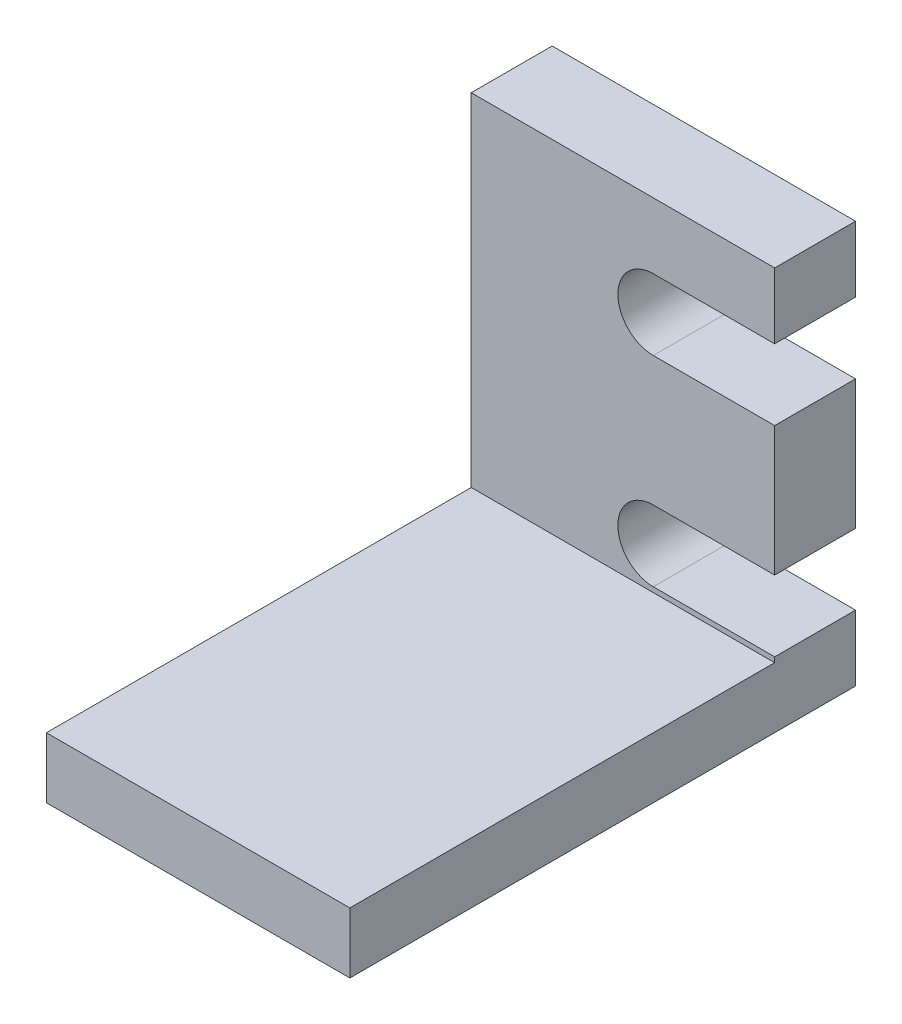
ISO-10303-21;
HEADER;
FILE_DESCRIPTION(('STEP AP214'),'2;1');
FILE_NAME('part.step','',(''),(''),'','','');
FILE_SCHEMA(('AUTOMOTIVE_DESIGN { 1 0 10303 214 1 1 1 1 }'));
ENDSEC;
DATA;
#1=APPLICATION_CONTEXT('core data for automotive mechanical design processes');
#2=APPLICATION_PROTOCOL_DEFINITION('international standard','automotive_design',2000,#1);
#3=PRODUCT_CONTEXT('',#1,'mechanical');
#4=PRODUCT('Part','Part','',(#3));
#5=PRODUCT_RELATED_PRODUCT_CATEGORY('part','',(#4));
#6=PRODUCT_DEFINITION_FORMATION('','',#4);
#7=PRODUCT_DEFINITION_CONTEXT('part definition',#1,'design');
#8=PRODUCT_DEFINITION('design','',#6,#7);
#9=PRODUCT_DEFINITION_SHAPE('','',#8);
#10=(LENGTH_UNIT() NAMED_UNIT(*) SI_UNIT(.MILLI.,.METRE.));
#11=(NAMED_UNIT(*) PLANE_ANGLE_UNIT() SI_UNIT($,.RADIAN.));
#12=(NAMED_UNIT(*) SI_UNIT($,.STERADIAN.) SOLID_ANGLE_UNIT());
#13=UNCERTAINTY_MEASURE_WITH_UNIT(LENGTH_MEASURE(1.E-05),#10,'distance_accuracy_value','');
#14=(GEOMETRIC_REPRESENTATION_CONTEXT(3) GLOBAL_UNCERTAINTY_ASSIGNED_CONTEXT((#13)) GLOBAL_UNIT_ASSIGNED_CONTEXT((#10,
#11,#12)) REPRESENTATION_CONTEXT('',''));
#15=CARTESIAN_POINT('',(0.,0.,0.));
#16=DIRECTION('',(0.,0.,1.));
#17=DIRECTION('',(1.,0.,0.));
#18=AXIS2_PLACEMENT_3D('',#15,#16,#17);
#19=CARTESIAN_POINT('',(9.,14.9,4.));
#20=DIRECTION('',(0.,0.,-1.));
#21=DIRECTION('',(-1.,0.,0.));
#22=AXIS2_PLACEMENT_3D('',#19,#20,#21);
#23=CYLINDRICAL_SURFACE('',#22,1.75);
#24=CARTESIAN_POINT('',(9.,14.9,0.));
#25=DIRECTION('',(0.,0.,1.));
#26=DIRECTION('',(1.,0.,0.));
#27=AXIS2_PLACEMENT_3D('',#24,#25,#26);
#28=CIRCLE('',#27,1.75);
#29=CARTESIAN_POINT('',(9.,16.65,0.));
#30=VERTEX_POINT('',#29);
#31=CARTESIAN_POINT('',(9.,13.15,0.));
#32=VERTEX_POINT('',#31);
#33=EDGE_CURVE('E190',#30,#32,#28,.T.);
#34=ORIENTED_EDGE('',*,*,#33,.F.);
#35=DIRECTION('',(0.,0.,-1.));
#36=VECTOR('',#35,1.);
#37=CARTESIAN_POINT('',(9.,16.65,4.));
#38=LINE('',#37,#36);
#39=CARTESIAN_POINT('',(9.,16.65,4.));
#40=VERTEX_POINT('',#39);
#41=EDGE_CURVE('E11',#40,#30,#38,.T.);
#42=ORIENTED_EDGE('',*,*,#41,.F.);
#43=CARTESIAN_POINT('',(9.,14.9,4.));
#44=DIRECTION('',(0.,0.,1.));
#45=DIRECTION('',(1.,0.,0.));
#46=AXIS2_PLACEMENT_3D('',#43,#44,#45);
#47=CIRCLE('',#46,1.75);
#48=CARTESIAN_POINT('',(9.,13.15,4.));
#49=VERTEX_POINT('',#48);
#50=EDGE_CURVE('E228',#40,#49,#47,.T.);
#51=ORIENTED_EDGE('',*,*,#50,.T.);
#52=DIRECTION('',(0.,0.,-1.));
#53=VECTOR('',#52,1.);
#54=CARTESIAN_POINT('',(9.,13.15,4.));
#55=LINE('',#54,#53);
#56=EDGE_CURVE('E65',#49,#32,#55,.T.);
#57=ORIENTED_EDGE('',*,*,#56,.T.);
#58=EDGE_LOOP('',(#34,#42,#51,#57));
#59=FACE_BOUND('',#58,.T.);
#60=ADVANCED_FACE('F41',(#59),#23,.F.);
#61=CARTESIAN_POINT('',(0.,16.65,4.));
#62=DIRECTION('',(0.,1.,0.));
#63=DIRECTION('',(0.,0.,1.));
#64=AXIS2_PLACEMENT_3D('',#61,#62,#63);
#65=PLANE('',#64);
#66=DIRECTION('',(1.,0.,0.));
#67=VECTOR('',#66,1.);
#68=CARTESIAN_POINT('',(0.,16.65,0.));
#69=LINE('',#68,#67);
#70=CARTESIAN_POINT('',(15.,16.65,0.));
#71=VERTEX_POINT('',#70);
#72=EDGE_CURVE('E193',#30,#71,#69,.T.);
#73=ORIENTED_EDGE('',*,*,#72,.T.);
#74=DIRECTION('',(0.,0.,-1.));
#75=VECTOR('',#74,1.);
#76=CARTESIAN_POINT('',(15.,16.65,4.));
#77=LINE('',#76,#75);
#78=CARTESIAN_POINT('',(15.,16.65,4.));
#79=VERTEX_POINT('',#78);
#80=EDGE_CURVE('E49',#79,#71,#77,.T.);
#81=ORIENTED_EDGE('',*,*,#80,.F.);
#82=DIRECTION('',(1.,0.,0.));
#83=VECTOR('',#82,1.);
#84=CARTESIAN_POINT('',(0.,16.65,4.));
#85=LINE('',#84,#83);
#86=EDGE_CURVE('E172',#40,#79,#85,.T.);
#87=ORIENTED_EDGE('',*,*,#86,.F.);
#88=ORIENTED_EDGE('',*,*,#41,.T.);
#89=EDGE_LOOP('',(#73,#81,#87,#88));
#90=FACE_BOUND('',#89,.T.);
#91=ADVANCED_FACE('F336',(#90),#65,.F.);
#92=CARTESIAN_POINT('',(15.,0.,4.));
#93=DIRECTION('',(-1.,0.,0.));
#94=DIRECTION('',(0.,0.,1.));
#95=AXIS2_PLACEMENT_3D('',#92,#93,#94);
#96=PLANE('',#95);
#97=DIRECTION('',(0.,1.,0.));
#98=VECTOR('',#97,1.);
#99=CARTESIAN_POINT('',(15.,0.,0.));
#100=LINE('',#99,#98);
#101=CARTESIAN_POINT('',(15.,19.9,0.));
#102=VERTEX_POINT('',#101);
#103=EDGE_CURVE('E197',#71,#102,#100,.T.);
#104=ORIENTED_EDGE('',*,*,#103,.T.);
#105=DIRECTION('',(0.,0.,-1.));
#106=VECTOR('',#105,1.);
#107=CARTESIAN_POINT('',(15.,19.9,4.));
#108=LINE('',#107,#106);
#109=CARTESIAN_POINT('',(15.,19.9,4.));
#110=VERTEX_POINT('',#109);
#111=EDGE_CURVE('E251',#110,#102,#108,.T.);
#112=ORIENTED_EDGE('',*,*,#111,.F.);
#113=DIRECTION('',(0.,1.,0.));
#114=VECTOR('',#113,1.);
#115=CARTESIAN_POINT('',(15.,0.,4.));
#116=LINE('',#115,#114);
#117=EDGE_CURVE('E164',#79,#110,#116,.T.);
#118=ORIENTED_EDGE('',*,*,#117,.F.);
#119=ORIENTED_EDGE('',*,*,#80,.T.);
#120=EDGE_LOOP('',(#104,#112,#118,#119));
#121=FACE_BOUND('',#120,.T.);
#122=ADVANCED_FACE('F259',(#121),#96,.F.);
#123=CARTESIAN_POINT('',(0.,19.9,4.));
#124=DIRECTION('',(0.,1.,0.));
#125=DIRECTION('',(0.,0.,1.));
#126=AXIS2_PLACEMENT_3D('',#123,#124,#125);
#127=PLANE('',#126);
#128=DIRECTION('',(1.,0.,0.));
#129=VECTOR('',#128,1.);
#130=CARTESIAN_POINT('',(0.,19.9,0.));
#131=LINE('',#130,#129);
#132=CARTESIAN_POINT('',(0.,19.9,0.));
#133=VERTEX_POINT('',#132);
#134=EDGE_CURVE('E201',#133,#102,#131,.T.);
#135=ORIENTED_EDGE('',*,*,#134,.F.);
#136=DIRECTION('',(0.,0.,-1.));
#137=VECTOR('',#136,1.);
#138=CARTESIAN_POINT('',(0.,19.9,4.));
#139=LINE('',#138,#137);
#140=CARTESIAN_POINT('',(0.,19.9,4.));
#141=VERTEX_POINT('',#140);
#142=EDGE_CURVE('E248',#141,#133,#139,.T.);
#143=ORIENTED_EDGE('',*,*,#142,.F.);
#144=DIRECTION('',(1.,0.,0.));
#145=VECTOR('',#144,1.);
#146=CARTESIAN_POINT('',(0.,19.9,4.));
#147=LINE('',#146,#145);
#148=EDGE_CURVE('E171',#141,#110,#147,.T.);
#149=ORIENTED_EDGE('',*,*,#148,.T.);
#150=ORIENTED_EDGE('',*,*,#111,.T.);
#151=EDGE_LOOP('',(#135,#143,#149,#150));
#152=FACE_BOUND('',#151,.T.);
#153=ADVANCED_FACE('F269',(#152),#127,.T.);
#154=CARTESIAN_POINT('',(0.,0.,4.));
#155=DIRECTION('',(-1.,0.,0.));
#156=DIRECTION('',(0.,0.,1.));
#157=AXIS2_PLACEMENT_3D('',#154,#155,#156);
#158=PLANE('',#157);
#159=DIRECTION('',(0.,1.,0.));
#160=VECTOR('',#159,1.);
#161=CARTESIAN_POINT('',(0.,0.,0.));
#162=LINE('',#161,#160);
#163=CARTESIAN_POINT('',(0.,0.,0.));
#164=VERTEX_POINT('',#163);
#165=EDGE_CURVE('E207',#164,#133,#162,.T.);
#166=ORIENTED_EDGE('',*,*,#165,.F.);
#167=DIRECTION('',(0.,0.,-1.));
#168=VECTOR('',#167,1.);
#169=CARTESIAN_POINT('',(0.,0.,4.));
#170=LINE('',#169,#168);
#171=CARTESIAN_POINT('',(0.,0.,25.));
#172=VERTEX_POINT('',#171);
#173=EDGE_CURVE('E245',#172,#164,#170,.T.);
#174=ORIENTED_EDGE('',*,*,#173,.F.);
#175=DIRECTION('',(0.,-1.,0.));
#176=VECTOR('',#175,1.);
#177=CARTESIAN_POINT('',(0.,0.,25.));
#178=LINE('',#177,#176);
#179=CARTESIAN_POINT('',(0.,3.,25.));
#180=VERTEX_POINT('',#179);
#181=EDGE_CURVE('E285',#180,#172,#178,.T.);
#182=ORIENTED_EDGE('',*,*,#181,.F.);
#183=DIRECTION('',(0.,0.,-1.));
#184=VECTOR('',#183,1.);
#185=CARTESIAN_POINT('',(0.,3.,25.));
#186=LINE('',#185,#184);
#187=CARTESIAN_POINT('',(0.,3.,4.));
#188=VERTEX_POINT('',#187);
#189=EDGE_CURVE('E279',#180,#188,#186,.T.);
#190=ORIENTED_EDGE('',*,*,#189,.T.);
#191=DIRECTION('',(0.,1.,0.));
#192=VECTOR('',#191,1.);
#193=CARTESIAN_POINT('',(0.,0.,4.));
#194=LINE('',#193,#192);
#195=EDGE_CURVE('E175',#188,#141,#194,.T.);
#196=ORIENTED_EDGE('',*,*,#195,.T.);
#197=ORIENTED_EDGE('',*,*,#142,.T.);
#198=EDGE_LOOP('',(#166,#174,#182,#190,#196,#197));
#199=FACE_BOUND('',#198,.T.);
#200=ADVANCED_FACE('F310',(#199),#158,.T.);
#201=CARTESIAN_POINT('',(0.,0.,4.));
#202=DIRECTION('',(0.,1.,0.));
#203=DIRECTION('',(-1.,0.,0.));
#204=AXIS2_PLACEMENT_3D('',#201,#202,#203);
#205=PLANE('',#204);
#206=DIRECTION('',(1.,0.,0.));
#207=VECTOR('',#206,1.);
#208=CARTESIAN_POINT('',(0.,0.,0.));
#209=LINE('',#208,#207);
#210=CARTESIAN_POINT('',(15.,0.,0.));
#211=VERTEX_POINT('',#210);
#212=EDGE_CURVE('E211',#164,#211,#209,.T.);
#213=ORIENTED_EDGE('',*,*,#212,.T.);
#214=DIRECTION('',(0.,0.,-1.));
#215=VECTOR('',#214,1.);
#216=CARTESIAN_POINT('',(15.,0.,4.));
#217=LINE('',#216,#215);
#218=CARTESIAN_POINT('',(15.,0.,25.));
#219=VERTEX_POINT('',#218);
#220=EDGE_CURVE('E241',#219,#211,#217,.T.);
#221=ORIENTED_EDGE('',*,*,#220,.F.);
#222=DIRECTION('',(1.,0.,0.));
#223=VECTOR('',#222,1.);
#224=CARTESIAN_POINT('',(0.,0.,25.));
#225=LINE('',#224,#223);
#226=EDGE_CURVE('E293',#172,#219,#225,.T.);
#227=ORIENTED_EDGE('',*,*,#226,.F.);
#228=ORIENTED_EDGE('',*,*,#173,.T.);
#229=EDGE_LOOP('',(#213,#221,#227,#228));
#230=FACE_BOUND('',#229,.T.);
#231=ADVANCED_FACE('F316',(#230),#205,.F.);
#232=CARTESIAN_POINT('',(15.,3.25,0.));
#233=VERTEX_POINT('',#232);
#234=EDGE_CURVE('E203',#211,#233,#100,.T.);
#235=ORIENTED_EDGE('',*,*,#234,.T.);
#236=DIRECTION('',(0.,0.,-1.));
#237=VECTOR('',#236,1.);
#238=CARTESIAN_POINT('',(15.,3.25,4.));
#239=LINE('',#238,#237);
#240=CARTESIAN_POINT('',(15.,3.25,4.));
#241=VERTEX_POINT('',#240);
#242=EDGE_CURVE('E238',#241,#233,#239,.T.);
#243=ORIENTED_EDGE('',*,*,#242,.F.);
#244=CARTESIAN_POINT('',(15.,3.,4.));
#245=VERTEX_POINT('',#244);
#246=EDGE_CURVE('E165',#245,#241,#116,.T.);
#247=ORIENTED_EDGE('',*,*,#246,.F.);
#248=DIRECTION('',(0.,0.,-1.));
#249=VECTOR('',#248,1.);
#250=CARTESIAN_POINT('',(15.,3.,25.));
#251=LINE('',#250,#249);
#252=CARTESIAN_POINT('',(15.,3.,25.));
#253=VERTEX_POINT('',#252);
#254=EDGE_CURVE('E194',#253,#245,#251,.T.);
#255=ORIENTED_EDGE('',*,*,#254,.F.);
#256=DIRECTION('',(0.,1.,0.));
#257=VECTOR('',#256,1.);
#258=CARTESIAN_POINT('',(15.,0.,25.));
#259=LINE('',#258,#257);
#260=EDGE_CURVE('E289',#219,#253,#259,.T.);
#261=ORIENTED_EDGE('',*,*,#260,.F.);
#262=ORIENTED_EDGE('',*,*,#220,.T.);
#263=EDGE_LOOP('',(#235,#243,#247,#255,#261,#262));
#264=FACE_BOUND('',#263,.T.);
#265=ADVANCED_FACE('F320',(#264),#96,.F.);
#266=CARTESIAN_POINT('',(0.,3.25,4.));
#267=DIRECTION('',(0.,1.,0.));
#268=DIRECTION('',(-1.,0.,0.));
#269=AXIS2_PLACEMENT_3D('',#266,#267,#268);
#270=PLANE('',#269);
#271=DIRECTION('',(1.,0.,0.));
#272=VECTOR('',#271,1.);
#273=CARTESIAN_POINT('',(0.,3.25,0.));
#274=LINE('',#273,#272);
#275=CARTESIAN_POINT('',(9.,3.25,0.));
#276=VERTEX_POINT('',#275);
#277=EDGE_CURVE('E214',#276,#233,#274,.T.);
#278=ORIENTED_EDGE('',*,*,#277,.F.);
#279=DIRECTION('',(0.,0.,-1.));
#280=VECTOR('',#279,1.);
#281=CARTESIAN_POINT('',(9.,3.25,4.));
#282=LINE('',#281,#280);
#283=CARTESIAN_POINT('',(9.,3.25,4.));
#284=VERTEX_POINT('',#283);
#285=EDGE_CURVE('E235',#284,#276,#282,.T.);
#286=ORIENTED_EDGE('',*,*,#285,.F.);
#287=DIRECTION('',(1.,0.,0.));
#288=VECTOR('',#287,1.);
#289=CARTESIAN_POINT('',(0.,3.25,4.));
#290=LINE('',#289,#288);
#291=EDGE_CURVE('E174',#284,#241,#290,.T.);
#292=ORIENTED_EDGE('',*,*,#291,.T.);
#293=ORIENTED_EDGE('',*,*,#242,.T.);
#294=EDGE_LOOP('',(#278,#286,#292,#293));
#295=FACE_BOUND('',#294,.T.);
#296=ADVANCED_FACE('F350',(#295),#270,.T.);
#297=CARTESIAN_POINT('',(9.,5.,4.));
#298=DIRECTION('',(0.,0.,-1.));
#299=DIRECTION('',(-1.,0.,0.));
#300=AXIS2_PLACEMENT_3D('',#297,#298,#299);
#301=CYLINDRICAL_SURFACE('',#300,1.75);
#302=CARTESIAN_POINT('',(9.,5.,0.));
#303=DIRECTION('',(0.,0.,1.));
#304=DIRECTION('',(1.,0.,0.));
#305=AXIS2_PLACEMENT_3D('',#302,#303,#304);
#306=CIRCLE('',#305,1.75);
#307=CARTESIAN_POINT('',(9.,6.75,0.));
#308=VERTEX_POINT('',#307);
#309=EDGE_CURVE('E218',#308,#276,#306,.T.);
#310=ORIENTED_EDGE('',*,*,#309,.F.);
#311=DIRECTION('',(0.,0.,-1.));
#312=VECTOR('',#311,1.);
#313=CARTESIAN_POINT('',(9.,6.75,4.));
#314=LINE('',#313,#312);
#315=CARTESIAN_POINT('',(9.,6.75,4.));
#316=VERTEX_POINT('',#315);
#317=EDGE_CURVE('E157',#316,#308,#314,.T.);
#318=ORIENTED_EDGE('',*,*,#317,.F.);
#319=CARTESIAN_POINT('',(9.,5.,4.));
#320=DIRECTION('',(0.,0.,1.));
#321=DIRECTION('',(1.,0.,0.));
#322=AXIS2_PLACEMENT_3D('',#319,#320,#321);
#323=CIRCLE('',#322,1.75);
#324=EDGE_CURVE('E144',#316,#284,#323,.T.);
#325=ORIENTED_EDGE('',*,*,#324,.T.);
#326=ORIENTED_EDGE('',*,*,#285,.T.);
#327=EDGE_LOOP('',(#310,#318,#325,#326));
#328=FACE_BOUND('',#327,.T.);
#329=ADVANCED_FACE('F353',(#328),#301,.F.);
#330=CARTESIAN_POINT('',(0.,6.75,4.));
#331=DIRECTION('',(0.,1.,0.));
#332=DIRECTION('',(-1.,0.,0.));
#333=AXIS2_PLACEMENT_3D('',#330,#331,#332);
#334=PLANE('',#333);
#335=DIRECTION('',(1.,0.,0.));
#336=VECTOR('',#335,1.);
#337=CARTESIAN_POINT('',(0.,6.75,0.));
#338=LINE('',#337,#336);
#339=CARTESIAN_POINT('',(15.,6.75,0.));
#340=VERTEX_POINT('',#339);
#341=EDGE_CURVE('E152',#308,#340,#338,.T.);
#342=ORIENTED_EDGE('',*,*,#341,.T.);
#343=DIRECTION('',(0.,0.,-1.));
#344=VECTOR('',#343,1.);
#345=CARTESIAN_POINT('',(15.,6.75,4.));
#346=LINE('',#345,#344);
#347=CARTESIAN_POINT('',(15.,6.75,4.));
#348=VERTEX_POINT('',#347);
#349=EDGE_CURVE('E149',#348,#340,#346,.T.);
#350=ORIENTED_EDGE('',*,*,#349,.F.);
#351=DIRECTION('',(1.,0.,0.));
#352=VECTOR('',#351,1.);
#353=CARTESIAN_POINT('',(0.,6.75,4.));
#354=LINE('',#353,#352);
#355=EDGE_CURVE('E135',#316,#348,#354,.T.);
#356=ORIENTED_EDGE('',*,*,#355,.F.);
#357=ORIENTED_EDGE('',*,*,#317,.T.);
#358=EDGE_LOOP('',(#342,#350,#356,#357));
#359=FACE_BOUND('',#358,.T.);
#360=ADVANCED_FACE('F150',(#359),#334,.F.);
#361=CARTESIAN_POINT('',(15.,13.15,0.));
#362=VERTEX_POINT('',#361);
#363=EDGE_CURVE('E202',#340,#362,#100,.T.);
#364=ORIENTED_EDGE('',*,*,#363,.T.);
#365=DIRECTION('',(0.,0.,-1.));
#366=VECTOR('',#365,1.);
#367=CARTESIAN_POINT('',(15.,13.15,4.));
#368=LINE('',#367,#366);
#369=CARTESIAN_POINT('',(15.,13.15,4.));
#370=VERTEX_POINT('',#369);
#371=EDGE_CURVE('E158',#370,#362,#368,.T.);
#372=ORIENTED_EDGE('',*,*,#371,.F.);
#373=EDGE_CURVE('E140',#348,#370,#116,.T.);
#374=ORIENTED_EDGE('',*,*,#373,.F.);
#375=ORIENTED_EDGE('',*,*,#349,.T.);
#376=EDGE_LOOP('',(#364,#372,#374,#375));
#377=FACE_BOUND('',#376,.T.);
#378=ADVANCED_FACE('F160',(#377),#96,.F.);
#379=CARTESIAN_POINT('',(0.,13.15,4.));
#380=DIRECTION('',(0.,1.,0.));
#381=DIRECTION('',(-1.,0.,0.));
#382=AXIS2_PLACEMENT_3D('',#379,#380,#381);
#383=PLANE('',#382);
#384=DIRECTION('',(1.,0.,0.));
#385=VECTOR('',#384,1.);
#386=CARTESIAN_POINT('',(0.,13.15,0.));
#387=LINE('',#386,#385);
#388=EDGE_CURVE('E224',#32,#362,#387,.T.);
#389=ORIENTED_EDGE('',*,*,#388,.F.);
#390=ORIENTED_EDGE('',*,*,#56,.F.);
#391=DIRECTION('',(1.,0.,0.));
#392=VECTOR('',#391,1.);
#393=CARTESIAN_POINT('',(0.,13.15,4.));
#394=LINE('',#393,#392);
#395=EDGE_CURVE('E162',#49,#370,#394,.T.);
#396=ORIENTED_EDGE('',*,*,#395,.T.);
#397=ORIENTED_EDGE('',*,*,#371,.T.);
#398=EDGE_LOOP('',(#389,#390,#396,#397));
#399=FACE_BOUND('',#398,.T.);
#400=ADVANCED_FACE('F325',(#399),#383,.T.);
#401=CARTESIAN_POINT('',(0.,0.,4.));
#402=DIRECTION('',(0.,0.,1.));
#403=DIRECTION('',(1.,0.,0.));
#404=AXIS2_PLACEMENT_3D('',#401,#402,#403);
#405=PLANE('',#404);
#406=DIRECTION('',(-1.,0.,0.));
#407=VECTOR('',#406,1.);
#408=CARTESIAN_POINT('',(0.,3.,4.));
#409=LINE('',#408,#407);
#410=EDGE_CURVE('E56',#245,#188,#409,.T.);
#411=ORIENTED_EDGE('',*,*,#410,.F.);
#412=ORIENTED_EDGE('',*,*,#246,.T.);
#413=ORIENTED_EDGE('',*,*,#291,.F.);
#414=ORIENTED_EDGE('',*,*,#324,.F.);
#415=ORIENTED_EDGE('',*,*,#355,.T.);
#416=ORIENTED_EDGE('',*,*,#373,.T.);
#417=ORIENTED_EDGE('',*,*,#395,.F.);
#418=ORIENTED_EDGE('',*,*,#50,.F.);
#419=ORIENTED_EDGE('',*,*,#86,.T.);
#420=ORIENTED_EDGE('',*,*,#117,.T.);
#421=ORIENTED_EDGE('',*,*,#148,.F.);
#422=ORIENTED_EDGE('',*,*,#195,.F.);
#423=EDGE_LOOP('',(#411,#412,#413,#414,#415,#416,#417,#418,#419,#420,#421,#422));
#424=FACE_BOUND('',#423,.T.);
#425=ADVANCED_FACE('F137',(#424),#405,.T.);
#426=CARTESIAN_POINT('',(0.,0.,0.));
#427=DIRECTION('',(0.,0.,1.));
#428=DIRECTION('',(1.,0.,0.));
#429=AXIS2_PLACEMENT_3D('',#426,#427,#428);
#430=PLANE('',#429);
#431=ORIENTED_EDGE('',*,*,#33,.T.);
#432=ORIENTED_EDGE('',*,*,#388,.T.);
#433=ORIENTED_EDGE('',*,*,#363,.F.);
#434=ORIENTED_EDGE('',*,*,#341,.F.);
#435=ORIENTED_EDGE('',*,*,#309,.T.);
#436=ORIENTED_EDGE('',*,*,#277,.T.);
#437=ORIENTED_EDGE('',*,*,#234,.F.);
#438=ORIENTED_EDGE('',*,*,#212,.F.);
#439=ORIENTED_EDGE('',*,*,#165,.T.);
#440=ORIENTED_EDGE('',*,*,#134,.T.);
#441=ORIENTED_EDGE('',*,*,#103,.F.);
#442=ORIENTED_EDGE('',*,*,#72,.F.);
#443=EDGE_LOOP('',(#431,#432,#433,#434,#435,#436,#437,#438,#439,#440,#441,#442));
#444=FACE_BOUND('',#443,.T.);
#445=ADVANCED_FACE('F264',(#444),#430,.F.);
#446=CARTESIAN_POINT('',(0.,3.,25.));
#447=DIRECTION('',(0.,-1.,0.));
#448=DIRECTION('',(0.,0.,-1.));
#449=AXIS2_PLACEMENT_3D('',#446,#447,#448);
#450=PLANE('',#449);
#451=ORIENTED_EDGE('',*,*,#410,.T.);
#452=ORIENTED_EDGE('',*,*,#189,.F.);
#453=DIRECTION('',(-1.,0.,0.));
#454=VECTOR('',#453,1.);
#455=CARTESIAN_POINT('',(0.,3.,25.));
#456=LINE('',#455,#454);
#457=EDGE_CURVE('E282',#253,#180,#456,.T.);
#458=ORIENTED_EDGE('',*,*,#457,.F.);
#459=ORIENTED_EDGE('',*,*,#254,.T.);
#460=EDGE_LOOP('',(#451,#452,#458,#459));
#461=FACE_BOUND('',#460,.T.);
#462=ADVANCED_FACE('F381',(#461),#450,.F.);
#463=CARTESIAN_POINT('',(0.,0.,25.));
#464=DIRECTION('',(0.,0.,-1.));
#465=DIRECTION('',(-1.,0.,0.));
#466=AXIS2_PLACEMENT_3D('',#463,#464,#465);
#467=PLANE('',#466);
#468=ORIENTED_EDGE('',*,*,#181,.T.);
#469=ORIENTED_EDGE('',*,*,#226,.T.);
#470=ORIENTED_EDGE('',*,*,#260,.T.);
#471=ORIENTED_EDGE('',*,*,#457,.T.);
#472=EDGE_LOOP('',(#468,#469,#470,#471));
#473=FACE_BOUND('',#472,.T.);
#474=ADVANCED_FACE('F302',(#473),#467,.F.);
#475=CLOSED_SHELL('',(#60,#91,#122,#153,#200,#231,#265,#296,#329,#360,#378,#400,#425,#445,#462,#474));
#476=MANIFOLD_SOLID_BREP('B2',#475);
#477=ADVANCED_BREP_SHAPE_REPRESENTATION('',(#18,#476),#14);
#478=SHAPE_DEFINITION_REPRESENTATION(#9,#477);
ENDSEC;
END-ISO-10303-21;
